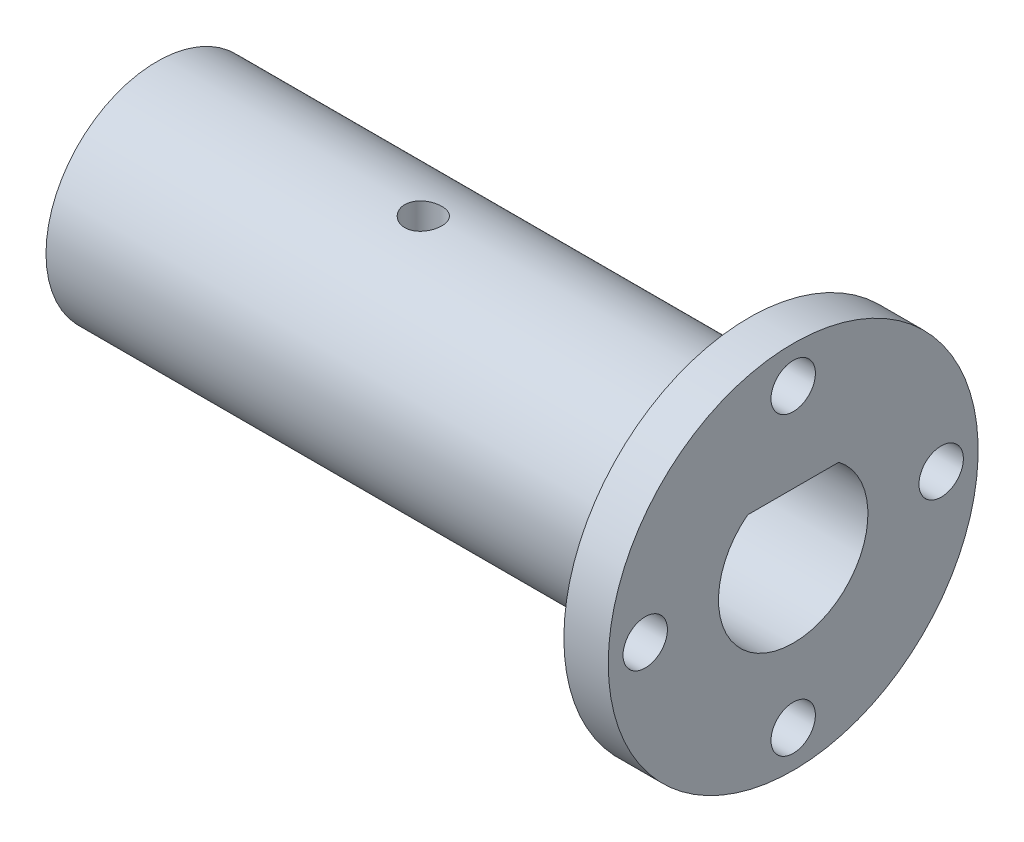
ISO-10303-21;
HEADER;
FILE_DESCRIPTION(('STEP AP214'),'2;1');
FILE_NAME('part.step','',(''),(''),'','','');
FILE_SCHEMA(('AUTOMOTIVE_DESIGN { 1 0 10303 214 1 1 1 1 }'));
ENDSEC;
DATA;
#1=APPLICATION_CONTEXT('core data for automotive mechanical design processes');
#2=APPLICATION_PROTOCOL_DEFINITION('international standard','automotive_design',2000,#1);
#3=PRODUCT_CONTEXT('',#1,'mechanical');
#4=PRODUCT('Part','Part','',(#3));
#5=PRODUCT_RELATED_PRODUCT_CATEGORY('part','',(#4));
#6=PRODUCT_DEFINITION_FORMATION('','',#4);
#7=PRODUCT_DEFINITION_CONTEXT('part definition',#1,'design');
#8=PRODUCT_DEFINITION('design','',#6,#7);
#9=PRODUCT_DEFINITION_SHAPE('','',#8);
#10=(LENGTH_UNIT() NAMED_UNIT(*) SI_UNIT(.MILLI.,.METRE.));
#11=(NAMED_UNIT(*) PLANE_ANGLE_UNIT() SI_UNIT($,.RADIAN.));
#12=(NAMED_UNIT(*) SI_UNIT($,.STERADIAN.) SOLID_ANGLE_UNIT());
#13=UNCERTAINTY_MEASURE_WITH_UNIT(LENGTH_MEASURE(1.E-05),#10,'distance_accuracy_value','');
#14=(GEOMETRIC_REPRESENTATION_CONTEXT(3) GLOBAL_UNCERTAINTY_ASSIGNED_CONTEXT((#13)) GLOBAL_UNIT_ASSIGNED_CONTEXT((#10,
#11,#12)) REPRESENTATION_CONTEXT('',''));
#15=CARTESIAN_POINT('',(0.,0.,0.));
#16=DIRECTION('',(0.,0.,1.));
#17=DIRECTION('',(1.,0.,0.));
#18=AXIS2_PLACEMENT_3D('',#15,#16,#17);
#19=CARTESIAN_POINT('',(43.,0.,0.));
#20=DIRECTION('',(-1.,0.,0.));
#21=DIRECTION('',(0.,0.,1.));
#22=AXIS2_PLACEMENT_3D('',#19,#20,#21);
#23=CYLINDRICAL_SURFACE('',#22,12.5);
#24=CARTESIAN_POINT('',(43.,0.,0.));
#25=DIRECTION('',(-1.,0.,0.));
#26=DIRECTION('',(0.,0.,1.));
#27=AXIS2_PLACEMENT_3D('',#24,#25,#26);
#28=CIRCLE('',#27,12.5);
#29=CARTESIAN_POINT('',(43.,0.,12.5));
#30=VERTEX_POINT('',#29);
#31=EDGE_CURVE('E39',#30,#30,#28,.T.);
#32=ORIENTED_EDGE('',*,*,#31,.T.);
#33=EDGE_LOOP('',(#32));
#34=FACE_BOUND('',#33,.T.);
#35=CARTESIAN_POINT('',(40.,0.,0.));
#36=DIRECTION('',(-1.,0.,0.));
#37=DIRECTION('',(0.,0.,1.));
#38=AXIS2_PLACEMENT_3D('',#35,#36,#37);
#39=CIRCLE('',#38,12.5);
#40=CARTESIAN_POINT('',(40.,0.,12.5));
#41=VERTEX_POINT('',#40);
#42=EDGE_CURVE('E88',#41,#41,#39,.T.);
#43=ORIENTED_EDGE('',*,*,#42,.F.);
#44=EDGE_LOOP('',(#43));
#45=FACE_BOUND('',#44,.T.);
#46=ADVANCED_FACE('F36',(#34,#45),#23,.T.);
#47=CARTESIAN_POINT('',(43.,12.5,0.));
#48=DIRECTION('',(1.,0.,0.));
#49=DIRECTION('',(0.,0.,-1.));
#50=AXIS2_PLACEMENT_3D('',#47,#48,#49);
#51=PLANE('',#50);
#52=CARTESIAN_POINT('',(43.,0.,10.));
#53=DIRECTION('',(-1.,0.,0.));
#54=DIRECTION('',(0.,0.,1.));
#55=AXIS2_PLACEMENT_3D('',#52,#53,#54);
#56=CIRCLE('',#55,1.49999999999999);
#57=CARTESIAN_POINT('',(43.,0.,11.5));
#58=VERTEX_POINT('',#57);
#59=EDGE_CURVE('E251',#58,#58,#56,.T.);
#60=ORIENTED_EDGE('',*,*,#59,.T.);
#61=EDGE_LOOP('',(#60));
#62=FACE_BOUND('',#61,.T.);
#63=CARTESIAN_POINT('',(43.,-10.,0.));
#64=DIRECTION('',(-1.,0.,0.));
#65=DIRECTION('',(0.,0.,1.));
#66=AXIS2_PLACEMENT_3D('',#63,#64,#65);
#67=CIRCLE('',#66,1.49999999999999);
#68=CARTESIAN_POINT('',(43.,-10.,1.49999999999999));
#69=VERTEX_POINT('',#68);
#70=EDGE_CURVE('E246',#69,#69,#67,.T.);
#71=ORIENTED_EDGE('',*,*,#70,.T.);
#72=EDGE_LOOP('',(#71));
#73=FACE_BOUND('',#72,.T.);
#74=CARTESIAN_POINT('',(43.,0.,-10.));
#75=DIRECTION('',(-1.,0.,0.));
#76=DIRECTION('',(0.,0.,1.));
#77=AXIS2_PLACEMENT_3D('',#74,#75,#76);
#78=CIRCLE('',#77,1.49999999999999);
#79=CARTESIAN_POINT('',(43.,0.,-8.50000000000001));
#80=VERTEX_POINT('',#79);
#81=EDGE_CURVE('E237',#80,#80,#78,.T.);
#82=ORIENTED_EDGE('',*,*,#81,.T.);
#83=EDGE_LOOP('',(#82));
#84=FACE_BOUND('',#83,.T.);
#85=CARTESIAN_POINT('',(43.,10.,0.));
#86=DIRECTION('',(-1.,0.,0.));
#87=DIRECTION('',(0.,0.,1.));
#88=AXIS2_PLACEMENT_3D('',#85,#86,#87);
#89=CIRCLE('',#88,1.49999999999999);
#90=CARTESIAN_POINT('',(43.,10.,1.49999999999999));
#91=VERTEX_POINT('',#90);
#92=EDGE_CURVE('E77',#91,#91,#89,.T.);
#93=ORIENTED_EDGE('',*,*,#92,.T.);
#94=EDGE_LOOP('',(#93));
#95=FACE_BOUND('',#94,.T.);
#96=CARTESIAN_POINT('',(43.,0.,0.));
#97=DIRECTION('',(-1.,0.,0.));
#98=DIRECTION('',(0.,0.,1.));
#99=AXIS2_PLACEMENT_3D('',#96,#97,#98);
#100=CIRCLE('',#99,5.05);
#101=CARTESIAN_POINT('',(43.,4.,-3.08261252835967));
#102=VERTEX_POINT('',#101);
#103=CARTESIAN_POINT('',(43.,4.,3.08261252835967));
#104=VERTEX_POINT('',#103);
#105=EDGE_CURVE('E51',#102,#104,#100,.T.);
#106=ORIENTED_EDGE('',*,*,#105,.T.);
#107=DIRECTION('',(0.,0.,-1.));
#108=VECTOR('',#107,1.);
#109=CARTESIAN_POINT('',(43.,4.,3.08261252835967));
#110=LINE('',#109,#108);
#111=EDGE_CURVE('E83',#104,#102,#110,.T.);
#112=ORIENTED_EDGE('',*,*,#111,.T.);
#113=EDGE_LOOP('',(#106,#112));
#114=FACE_BOUND('',#113,.T.);
#115=ORIENTED_EDGE('',*,*,#31,.F.);
#116=EDGE_LOOP('',(#115));
#117=FACE_BOUND('',#116,.T.);
#118=ADVANCED_FACE('F97',(#62,#73,#84,#95,#114,#117),#51,.T.);
#119=CARTESIAN_POINT('',(40.,0.,0.));
#120=DIRECTION('',(-1.,0.,0.));
#121=DIRECTION('',(0.,0.,1.));
#122=AXIS2_PLACEMENT_3D('',#119,#120,#121);
#123=PLANE('',#122);
#124=CARTESIAN_POINT('',(40.,0.,10.));
#125=DIRECTION('',(-1.,0.,0.));
#126=DIRECTION('',(0.,0.,1.));
#127=AXIS2_PLACEMENT_3D('',#124,#125,#126);
#128=CIRCLE('',#127,1.49999999999999);
#129=CARTESIAN_POINT('',(40.,0.,11.5));
#130=VERTEX_POINT('',#129);
#131=EDGE_CURVE('E125',#130,#130,#128,.T.);
#132=ORIENTED_EDGE('',*,*,#131,.F.);
#133=EDGE_LOOP('',(#132));
#134=FACE_BOUND('',#133,.T.);
#135=CARTESIAN_POINT('',(40.,-10.,0.));
#136=DIRECTION('',(-1.,0.,0.));
#137=DIRECTION('',(0.,0.,1.));
#138=AXIS2_PLACEMENT_3D('',#135,#136,#137);
#139=CIRCLE('',#138,1.49999999999999);
#140=CARTESIAN_POINT('',(40.,-10.,1.49999999999999));
#141=VERTEX_POINT('',#140);
#142=EDGE_CURVE('E249',#141,#141,#139,.T.);
#143=ORIENTED_EDGE('',*,*,#142,.F.);
#144=EDGE_LOOP('',(#143));
#145=FACE_BOUND('',#144,.T.);
#146=CARTESIAN_POINT('',(40.,0.,-10.));
#147=DIRECTION('',(-1.,0.,0.));
#148=DIRECTION('',(0.,0.,1.));
#149=AXIS2_PLACEMENT_3D('',#146,#147,#148);
#150=CIRCLE('',#149,1.49999999999999);
#151=CARTESIAN_POINT('',(40.,0.,-8.50000000000001));
#152=VERTEX_POINT('',#151);
#153=EDGE_CURVE('E240',#152,#152,#150,.T.);
#154=ORIENTED_EDGE('',*,*,#153,.F.);
#155=EDGE_LOOP('',(#154));
#156=FACE_BOUND('',#155,.T.);
#157=CARTESIAN_POINT('',(40.,10.,0.));
#158=DIRECTION('',(-1.,0.,0.));
#159=DIRECTION('',(0.,0.,1.));
#160=AXIS2_PLACEMENT_3D('',#157,#158,#159);
#161=CIRCLE('',#160,1.49999999999999);
#162=CARTESIAN_POINT('',(40.,10.,1.49999999999999));
#163=VERTEX_POINT('',#162);
#164=EDGE_CURVE('E80',#163,#163,#161,.T.);
#165=ORIENTED_EDGE('',*,*,#164,.F.);
#166=EDGE_LOOP('',(#165));
#167=FACE_BOUND('',#166,.T.);
#168=CARTESIAN_POINT('',(40.,0.,0.));
#169=DIRECTION('',(-1.,0.,0.));
#170=DIRECTION('',(0.,0.,1.));
#171=AXIS2_PLACEMENT_3D('',#168,#169,#170);
#172=CIRCLE('',#171,7.5);
#173=CARTESIAN_POINT('',(40.,0.,7.5));
#174=VERTEX_POINT('',#173);
#175=EDGE_CURVE('E11',#174,#174,#172,.T.);
#176=ORIENTED_EDGE('',*,*,#175,.F.);
#177=EDGE_LOOP('',(#176));
#178=FACE_BOUND('',#177,.T.);
#179=ORIENTED_EDGE('',*,*,#42,.T.);
#180=EDGE_LOOP('',(#179));
#181=FACE_BOUND('',#180,.T.);
#182=ADVANCED_FACE('F99',(#134,#145,#156,#167,#178,#181),#123,.T.);
#183=CARTESIAN_POINT('',(0.,0.,0.));
#184=DIRECTION('',(1.,0.,0.));
#185=DIRECTION('',(0.,0.,-1.));
#186=AXIS2_PLACEMENT_3D('',#183,#184,#185);
#187=CYLINDRICAL_SURFACE('',#186,7.5);
#188=CARTESIAN_POINT('',(18.,7.39509972887452,-1.25));
#189=CARTESIAN_POINT('',(18.069687874073,7.39510098700638,-1.2499971992105));
#190=CARTESIAN_POINT('',(18.1394138030124,7.39609546274033,-1.24415258451866));
#191=CARTESIAN_POINT('',(18.2769092716101,7.39996228684089,-1.2209387140377));
#192=CARTESIAN_POINT('',(18.3446769468748,7.40283636695714,-1.20355883015483));
#193=CARTESIAN_POINT('',(18.4762461416784,7.41012804661162,-1.15781477183357));
#194=CARTESIAN_POINT('',(18.5400509243332,7.41454435585975,-1.12945977746555));
#195=CARTESIAN_POINT('',(18.6619904773569,7.4244213605717,-1.06259324844519));
#196=CARTESIAN_POINT('',(18.7201258847881,7.42988193848737,-1.02408285675079));
#197=CARTESIAN_POINT('',(18.8296564248728,7.44129235576304,-0.937593763483151));
#198=CARTESIAN_POINT('',(18.8809875656933,7.44724608663534,-0.889534524466138));
#199=CARTESIAN_POINT('',(18.9748966534308,7.45893740334729,-0.785486002347672));
#200=CARTESIAN_POINT('',(19.0174740815577,7.46467497635985,-0.729496249574996));
#201=CARTESIAN_POINT('',(19.0929072836097,7.47532868491235,-0.610761434974169));
#202=CARTESIAN_POINT('',(19.1257035038659,7.48023971216138,-0.547978040728352));
#203=CARTESIAN_POINT('',(19.1802605352653,7.48864368478577,-0.417697810861936));
#204=CARTESIAN_POINT('',(19.2020220639424,7.49213672236337,-0.350201282039094));
#205=CARTESIAN_POINT('',(19.233696267492,7.4972836736219,-0.21307186317212));
#206=CARTESIAN_POINT('',(19.2437164580023,7.49895426555452,-0.143464443339635));
#207=CARTESIAN_POINT('',(19.2519578770763,7.5003253967139,-0.00353764276289864));
#208=CARTESIAN_POINT('',(19.2501799076236,7.50002606984654,0.0667816892644494));
#209=CARTESIAN_POINT('',(19.2349593242359,7.49750429215695,0.205401092539439));
#210=CARTESIAN_POINT('',(19.2216324182954,7.49530091846198,0.273714265350072));
#211=CARTESIAN_POINT('',(19.1838744628768,7.48923989385818,0.407120989805897));
#212=CARTESIAN_POINT('',(19.1594430752052,7.48538219256606,0.472214443325753));
#213=CARTESIAN_POINT('',(19.1000546798423,7.47641349255979,0.597678073891324));
#214=CARTESIAN_POINT('',(19.0650499939588,7.4712968366344,0.658025261509522));
#215=CARTESIAN_POINT('',(18.9855435886825,7.46037869035748,0.77203276492332));
#216=CARTESIAN_POINT('',(18.9410411006446,7.45457714459567,0.825692538957937));
#217=CARTESIAN_POINT('',(18.8431605966903,7.44285134116298,0.925485636723333));
#218=CARTESIAN_POINT('',(18.7896814525495,7.43692644865521,0.971519751126604));
#219=CARTESIAN_POINT('',(18.6757064548921,7.42568979892403,1.05397729422403));
#220=CARTESIAN_POINT('',(18.6152105366586,7.42037804735662,1.09040063426621));
#221=CARTESIAN_POINT('',(18.4888041790613,7.41096877280908,1.15262221724414));
#222=CARTESIAN_POINT('',(18.422887750954,7.40687261651301,1.17840851363962));
#223=CARTESIAN_POINT('',(18.2875754638462,7.4003809434494,1.21851493540781));
#224=CARTESIAN_POINT('',(18.2181799117838,7.39798527694161,1.23283607038398));
#225=CARTESIAN_POINT('',(18.0787669219189,7.39519479711058,1.24946594243963));
#226=CARTESIAN_POINT('',(18.0087668101489,7.39477642879334,1.25191610395622));
#227=CARTESIAN_POINT('',(17.8693566641546,7.39592517391181,1.24511135134123));
#228=CARTESIAN_POINT('',(17.799946607243,7.39749221065927,1.23585688931233));
#229=CARTESIAN_POINT('',(17.6641361204046,7.40241343727509,1.20602616746405));
#230=CARTESIAN_POINT('',(17.597719430061,7.40575625959174,1.18552189532319));
#231=CARTESIAN_POINT('',(17.4692649168603,7.41384286502751,1.13384909509614));
#232=CARTESIAN_POINT('',(17.4072273562245,7.41858673195289,1.10267992905047));
#233=CARTESIAN_POINT('',(17.2886627027969,7.42899564198697,1.03022833661462));
#234=CARTESIAN_POINT('',(17.232191713622,7.43466877800174,0.988855282079684));
#235=CARTESIAN_POINT('',(17.1269432336525,7.44627333339933,0.897294732853993));
#236=CARTESIAN_POINT('',(17.0781662844451,7.45220477092666,0.847106618192024));
#237=CARTESIAN_POINT('',(16.9891740536356,7.46373211059132,0.738714035164405));
#238=CARTESIAN_POINT('',(16.9490530868577,7.46932388172336,0.680431626693098));
#239=CARTESIAN_POINT('',(16.8791723364976,7.47947556216471,0.557871723974663));
#240=CARTESIAN_POINT('',(16.8494122177631,7.48403550484988,0.493594423735313));
#241=CARTESIAN_POINT('',(16.8012447080226,7.49159179084791,0.361149525750664));
#242=CARTESIAN_POINT('',(16.7827879621325,7.49459492283811,0.293000281301305));
#243=CARTESIAN_POINT('',(16.7575922005181,7.4987279158464,0.154515367437106));
#244=CARTESIAN_POINT('',(16.7508522206338,7.49985793100089,0.0841798784108125));
#245=CARTESIAN_POINT('',(16.7493090588439,7.50011518943913,-0.05577063788684));
#246=CARTESIAN_POINT('',(16.7543623730295,7.4992665101212,-0.12538408030134));
#247=CARTESIAN_POINT('',(16.7759519611347,7.49571089193641,-0.262755987157345));
#248=CARTESIAN_POINT('',(16.7924881707548,7.49300396347501,-0.330514461983713));
#249=CARTESIAN_POINT('',(16.8365190827719,7.48603494413793,-0.462198222959296));
#250=CARTESIAN_POINT('',(16.8640015841052,7.48177458520777,-0.526127686077012));
#251=CARTESIAN_POINT('',(16.9291289681151,7.47216378438676,-0.648490226490983));
#252=CARTESIAN_POINT('',(16.9667743325305,7.46681329082441,-0.706923043058733));
#253=CARTESIAN_POINT('',(17.051667546231,7.45553814809486,-0.817356472763581));
#254=CARTESIAN_POINT('',(17.0990204773784,7.44960762275367,-0.869275715302808));
#255=CARTESIAN_POINT('',(17.2017641539491,7.43788151652376,-0.964481937974022));
#256=CARTESIAN_POINT('',(17.2571567794458,7.43208596756801,-1.0077668933506));
#257=CARTESIAN_POINT('',(17.3748726612538,7.42124171785049,-1.08475713545981));
#258=CARTESIAN_POINT('',(17.437242169919,7.41619858990617,-1.11839249454727));
#259=CARTESIAN_POINT('',(17.5668046179557,7.40749605110885,-1.17465726822046));
#260=CARTESIAN_POINT('',(17.6339926613484,7.40383525875637,-1.1972976776158));
#261=CARTESIAN_POINT('',(17.7512018847383,7.3991237241889,-1.22601302656107));
#262=CARTESIAN_POINT('',(17.8005134039792,7.39762311710509,-1.23499370883514));
#263=CARTESIAN_POINT('',(17.8998767424206,7.3956106764326,-1.24698814759121));
#264=CARTESIAN_POINT('',(17.9499285481651,7.39509882489388,-1.25000201239596));
#265=CARTESIAN_POINT('',(18.,7.39509972887452,-1.25));
#266=B_SPLINE_CURVE_WITH_KNOTS('',3,(#188,#189,#190,#191,#192,#193,#194,#195,#196,#197,#198,
#199,#200,#201,#202,#203,#204,#205,#206,#207,#208,#209,#210,#211,#212,#213,#214,#215,#216,#217,
#218,#219,#220,#221,#222,#223,#224,#225,#226,#227,#228,#229,#230,#231,#232,#233,#234,#235,#236,
#237,#238,#239,#240,#241,#242,#243,#244,#245,#246,#247,#248,#249,#250,#251,#252,#253,#254,#255,
#256,#257,#258,#259,#260,#261,#262,#263,#264,#265),.UNSPECIFIED.,.T.,.F.,(4,2,2,2,2,2,2,2,2,2,2,
2,2,2,2,2,2,2,2,2,2,2,2,2,2,2,2,2,2,2,2,2,2,2,2,2,2,2,4),(0.,0.208880519452657,
0.417953759959724,0.626852498915829,0.835727737004608,1.04644579575681,1.25717633915048,
1.46916490053542,1.68113967553381,1.89115783734107,2.1011617232417,2.30908560580158,
2.51701582122591,2.72589802067537,2.93479713111206,3.14623061728886,3.35766605370834,
3.56933831247126,3.78099192966863,3.9901177120803,4.19923541704812,4.4070303231557,
4.61483766144611,4.82456171379175,5.03430052213169,5.24622056515515,5.45813375236173,
5.66911492206647,5.88007872954,6.08848888130782,6.29689786607236,6.50507519914053,
6.71326240193992,6.92383498729451,7.1344568943873,7.34656863806425,7.55846783368814,
7.70855335268469,7.85863614697496),.UNSPECIFIED.);
#267=CARTESIAN_POINT('',(18.,7.39509972887452,-1.25));
#268=VERTEX_POINT('',#267);
#269=EDGE_CURVE('E117',#268,#268,#266,.T.);
#270=ORIENTED_EDGE('',*,*,#269,.T.);
#271=EDGE_LOOP('',(#270));
#272=FACE_BOUND('',#271,.T.);
#273=CARTESIAN_POINT('',(0.,0.,0.));
#274=DIRECTION('',(-1.,0.,0.));
#275=DIRECTION('',(0.,0.,1.));
#276=AXIS2_PLACEMENT_3D('',#273,#274,#275);
#277=CIRCLE('',#276,7.5);
#278=CARTESIAN_POINT('',(0.,0.,7.5));
#279=VERTEX_POINT('',#278);
#280=EDGE_CURVE('E67',#279,#279,#277,.T.);
#281=ORIENTED_EDGE('',*,*,#280,.F.);
#282=EDGE_LOOP('',(#281));
#283=FACE_BOUND('',#282,.T.);
#284=ORIENTED_EDGE('',*,*,#175,.T.);
#285=EDGE_LOOP('',(#284));
#286=FACE_BOUND('',#285,.T.);
#287=ADVANCED_FACE('F105',(#272,#283,#286),#187,.T.);
#288=CARTESIAN_POINT('',(0.,0.,0.));
#289=DIRECTION('',(-1.,0.,0.));
#290=DIRECTION('',(0.,0.,1.));
#291=AXIS2_PLACEMENT_3D('',#288,#289,#290);
#292=PLANE('',#291);
#293=CARTESIAN_POINT('',(0.,0.,0.));
#294=DIRECTION('',(-1.,0.,0.));
#295=DIRECTION('',(0.,0.,1.));
#296=AXIS2_PLACEMENT_3D('',#293,#294,#295);
#297=CIRCLE('',#296,5.05);
#298=CARTESIAN_POINT('',(0.,4.,-3.08261252835967));
#299=VERTEX_POINT('',#298);
#300=CARTESIAN_POINT('',(0.,4.,3.08261252835967));
#301=VERTEX_POINT('',#300);
#302=EDGE_CURVE('E56',#299,#301,#297,.T.);
#303=ORIENTED_EDGE('',*,*,#302,.F.);
#304=DIRECTION('',(0.,0.,-1.));
#305=VECTOR('',#304,1.);
#306=CARTESIAN_POINT('',(0.,4.,3.08261252835967));
#307=LINE('',#306,#305);
#308=EDGE_CURVE('E71',#301,#299,#307,.T.);
#309=ORIENTED_EDGE('',*,*,#308,.F.);
#310=EDGE_LOOP('',(#303,#309));
#311=FACE_BOUND('',#310,.T.);
#312=ORIENTED_EDGE('',*,*,#280,.T.);
#313=EDGE_LOOP('',(#312));
#314=FACE_BOUND('',#313,.T.);
#315=ADVANCED_FACE('F75',(#311,#314),#292,.T.);
#316=CARTESIAN_POINT('',(43.,0.,0.));
#317=DIRECTION('',(-1.,0.,0.));
#318=DIRECTION('',(0.,0.,1.));
#319=AXIS2_PLACEMENT_3D('',#316,#317,#318);
#320=CYLINDRICAL_SURFACE('',#319,5.05);
#321=ORIENTED_EDGE('',*,*,#302,.T.);
#322=DIRECTION('',(-1.,0.,0.));
#323=VECTOR('',#322,1.);
#324=CARTESIAN_POINT('',(43.,4.,3.08261252835967));
#325=LINE('',#324,#323);
#326=EDGE_CURVE('E68',#104,#301,#325,.T.);
#327=ORIENTED_EDGE('',*,*,#326,.F.);
#328=ORIENTED_EDGE('',*,*,#105,.F.);
#329=DIRECTION('',(-1.,0.,0.));
#330=VECTOR('',#329,1.);
#331=CARTESIAN_POINT('',(43.,4.,-3.08261252835967));
#332=LINE('',#331,#330);
#333=EDGE_CURVE('E61',#102,#299,#332,.T.);
#334=ORIENTED_EDGE('',*,*,#333,.T.);
#335=EDGE_LOOP('',(#321,#327,#328,#334));
#336=FACE_BOUND('',#335,.T.);
#337=ADVANCED_FACE('F63',(#336),#320,.F.);
#338=CARTESIAN_POINT('',(43.,4.,3.08261252835967));
#339=DIRECTION('',(0.,1.,0.));
#340=DIRECTION('',(0.,0.,1.));
#341=AXIS2_PLACEMENT_3D('',#338,#339,#340);
#342=PLANE('',#341);
#343=CARTESIAN_POINT('',(18.,4.,0.));
#344=DIRECTION('',(0.,-1.,0.));
#345=DIRECTION('',(0.,0.,-1.));
#346=AXIS2_PLACEMENT_3D('',#343,#344,#345);
#347=CIRCLE('',#346,1.25);
#348=CARTESIAN_POINT('',(18.,4.,-1.25));
#349=VERTEX_POINT('',#348);
#350=EDGE_CURVE('E126',#349,#349,#347,.T.);
#351=ORIENTED_EDGE('',*,*,#350,.F.);
#352=EDGE_LOOP('',(#351));
#353=FACE_BOUND('',#352,.T.);
#354=ORIENTED_EDGE('',*,*,#308,.T.);
#355=ORIENTED_EDGE('',*,*,#333,.F.);
#356=ORIENTED_EDGE('',*,*,#111,.F.);
#357=ORIENTED_EDGE('',*,*,#326,.T.);
#358=EDGE_LOOP('',(#354,#355,#356,#357));
#359=FACE_BOUND('',#358,.T.);
#360=ADVANCED_FACE('F72',(#353,#359),#342,.F.);
#361=CARTESIAN_POINT('',(40.,10.,0.));
#362=DIRECTION('',(-1.,0.,0.));
#363=DIRECTION('',(0.,0.,1.));
#364=AXIS2_PLACEMENT_3D('',#361,#362,#363);
#365=CYLINDRICAL_SURFACE('',#364,1.49999999999999);
#366=ORIENTED_EDGE('',*,*,#92,.F.);
#367=EDGE_LOOP('',(#366));
#368=FACE_BOUND('',#367,.T.);
#369=ORIENTED_EDGE('',*,*,#164,.T.);
#370=EDGE_LOOP('',(#369));
#371=FACE_BOUND('',#370,.T.);
#372=ADVANCED_FACE('F144',(#368,#371),#365,.F.);
#373=CARTESIAN_POINT('',(40.,0.,-10.));
#374=DIRECTION('',(-1.,0.,0.));
#375=DIRECTION('',(0.,0.,1.));
#376=AXIS2_PLACEMENT_3D('',#373,#374,#375);
#377=CYLINDRICAL_SURFACE('',#376,1.49999999999999);
#378=ORIENTED_EDGE('',*,*,#81,.F.);
#379=EDGE_LOOP('',(#378));
#380=FACE_BOUND('',#379,.T.);
#381=ORIENTED_EDGE('',*,*,#153,.T.);
#382=EDGE_LOOP('',(#381));
#383=FACE_BOUND('',#382,.T.);
#384=ADVANCED_FACE('F140',(#380,#383),#377,.F.);
#385=CARTESIAN_POINT('',(40.,-10.,0.));
#386=DIRECTION('',(-1.,0.,0.));
#387=DIRECTION('',(0.,0.,1.));
#388=AXIS2_PLACEMENT_3D('',#385,#386,#387);
#389=CYLINDRICAL_SURFACE('',#388,1.49999999999999);
#390=ORIENTED_EDGE('',*,*,#70,.F.);
#391=EDGE_LOOP('',(#390));
#392=FACE_BOUND('',#391,.T.);
#393=ORIENTED_EDGE('',*,*,#142,.T.);
#394=EDGE_LOOP('',(#393));
#395=FACE_BOUND('',#394,.T.);
#396=ADVANCED_FACE('F136',(#392,#395),#389,.F.);
#397=CARTESIAN_POINT('',(40.,0.,10.));
#398=DIRECTION('',(-1.,0.,0.));
#399=DIRECTION('',(0.,0.,1.));
#400=AXIS2_PLACEMENT_3D('',#397,#398,#399);
#401=CYLINDRICAL_SURFACE('',#400,1.49999999999999);
#402=ORIENTED_EDGE('',*,*,#59,.F.);
#403=EDGE_LOOP('',(#402));
#404=FACE_BOUND('',#403,.T.);
#405=ORIENTED_EDGE('',*,*,#131,.T.);
#406=EDGE_LOOP('',(#405));
#407=FACE_BOUND('',#406,.T.);
#408=ADVANCED_FACE('F132',(#404,#407),#401,.F.);
#409=CARTESIAN_POINT('',(18.,14.,0.));
#410=DIRECTION('',(0.,-1.,0.));
#411=DIRECTION('',(0.,0.,-1.));
#412=AXIS2_PLACEMENT_3D('',#409,#410,#411);
#413=CYLINDRICAL_SURFACE('',#412,1.25);
#414=ORIENTED_EDGE('',*,*,#350,.T.);
#415=EDGE_LOOP('',(#414));
#416=FACE_BOUND('',#415,.T.);
#417=ORIENTED_EDGE('',*,*,#269,.F.);
#418=EDGE_LOOP('',(#417));
#419=FACE_BOUND('',#418,.T.);
#420=ADVANCED_FACE('F128',(#416,#419),#413,.F.);
#421=CLOSED_SHELL('',(#46,#118,#182,#287,#315,#337,#360,#372,#384,#396,#408,#420));
#422=MANIFOLD_SOLID_BREP('B2',#421);
#423=ADVANCED_BREP_SHAPE_REPRESENTATION('',(#18,#422),#14);
#424=SHAPE_DEFINITION_REPRESENTATION(#9,#423);
ENDSEC;
END-ISO-10303-21;
